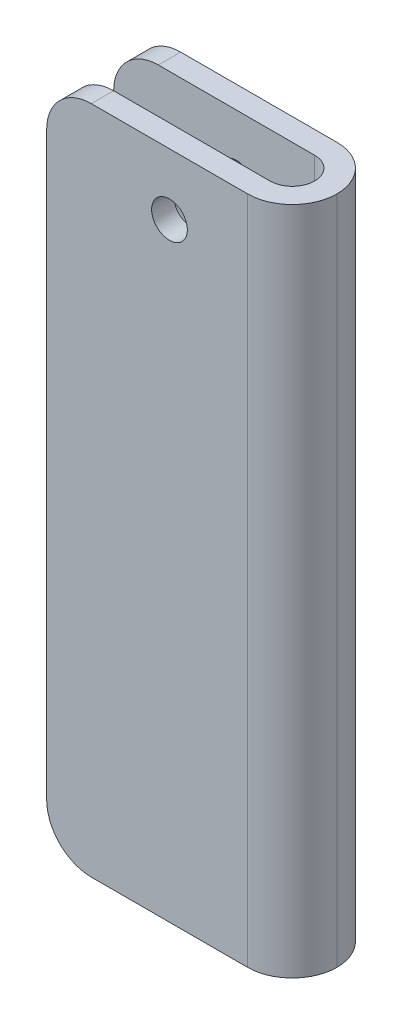
ISO-10303-21;
HEADER;
FILE_DESCRIPTION(('STEP AP214'),'2;1');
FILE_NAME('part.step','',(''),(''),'','','');
FILE_SCHEMA(('AUTOMOTIVE_DESIGN { 1 0 10303 214 1 1 1 1 }'));
ENDSEC;
DATA;
#1=APPLICATION_CONTEXT('core data for automotive mechanical design processes');
#2=APPLICATION_PROTOCOL_DEFINITION('international standard','automotive_design',2000,#1);
#3=PRODUCT_CONTEXT('',#1,'mechanical');
#4=PRODUCT('Part','Part','',(#3));
#5=PRODUCT_RELATED_PRODUCT_CATEGORY('part','',(#4));
#6=PRODUCT_DEFINITION_FORMATION('','',#4);
#7=PRODUCT_DEFINITION_CONTEXT('part definition',#1,'design');
#8=PRODUCT_DEFINITION('design','',#6,#7);
#9=PRODUCT_DEFINITION_SHAPE('','',#8);
#10=(LENGTH_UNIT() NAMED_UNIT(*) SI_UNIT(.MILLI.,.METRE.));
#11=(NAMED_UNIT(*) PLANE_ANGLE_UNIT() SI_UNIT($,.RADIAN.));
#12=(NAMED_UNIT(*) SI_UNIT($,.STERADIAN.) SOLID_ANGLE_UNIT());
#13=UNCERTAINTY_MEASURE_WITH_UNIT(LENGTH_MEASURE(1.E-05),#10,'distance_accuracy_value','');
#14=(GEOMETRIC_REPRESENTATION_CONTEXT(3) GLOBAL_UNCERTAINTY_ASSIGNED_CONTEXT((#13)) GLOBAL_UNIT_ASSIGNED_CONTEXT((#10,
#11,#12)) REPRESENTATION_CONTEXT('',''));
#15=CARTESIAN_POINT('',(0.,0.,0.));
#16=DIRECTION('',(0.,0.,1.));
#17=DIRECTION('',(1.,0.,0.));
#18=AXIS2_PLACEMENT_3D('',#15,#16,#17);
#19=CARTESIAN_POINT('',(-55.,0.,20.));
#20=DIRECTION('',(1.,0.,0.));
#21=DIRECTION('',(0.,0.,-1.));
#22=AXIS2_PLACEMENT_3D('',#19,#20,#21);
#23=PLANE('',#22);
#24=DIRECTION('',(0.,-1.,0.));
#25=VECTOR('',#24,1.);
#26=CARTESIAN_POINT('',(-55.,0.,0.));
#27=LINE('',#26,#25);
#28=CARTESIAN_POINT('',(-55.,140.,0.));
#29=VERTEX_POINT('',#28);
#30=CARTESIAN_POINT('',(-55.,10.,0.));
#31=VERTEX_POINT('',#30);
#32=EDGE_CURVE('E252',#29,#31,#27,.T.);
#33=ORIENTED_EDGE('',*,*,#32,.T.);
#34=DIRECTION('',(0.,0.,-1.));
#35=VECTOR('',#34,1.);
#36=CARTESIAN_POINT('',(-55.,10.,20.));
#37=LINE('',#36,#35);
#38=CARTESIAN_POINT('',(-55.,10.,5.));
#39=VERTEX_POINT('',#38);
#40=EDGE_CURVE('E206',#31,#39,#37,.F.);
#41=ORIENTED_EDGE('',*,*,#40,.T.);
#42=DIRECTION('',(0.,1.,0.));
#43=VECTOR('',#42,1.);
#44=CARTESIAN_POINT('',(-55.,0.,5.));
#45=LINE('',#44,#43);
#46=CARTESIAN_POINT('',(-55.,140.,5.));
#47=VERTEX_POINT('',#46);
#48=EDGE_CURVE('E238',#39,#47,#45,.T.);
#49=ORIENTED_EDGE('',*,*,#48,.T.);
#50=DIRECTION('',(0.,0.,-1.));
#51=VECTOR('',#50,1.);
#52=CARTESIAN_POINT('',(-55.,140.,20.));
#53=LINE('',#52,#51);
#54=EDGE_CURVE('E203',#47,#29,#53,.T.);
#55=ORIENTED_EDGE('',*,*,#54,.T.);
#56=EDGE_LOOP('',(#33,#41,#49,#55));
#57=FACE_BOUND('',#56,.T.);
#58=ADVANCED_FACE('F32',(#57),#23,.F.);
#59=CARTESIAN_POINT('',(0.,150.,20.));
#60=DIRECTION('',(0.,-1.,0.));
#61=DIRECTION('',(0.,0.,-1.));
#62=AXIS2_PLACEMENT_3D('',#59,#60,#61);
#63=PLANE('',#62);
#64=DIRECTION('',(-1.,0.,0.));
#65=VECTOR('',#64,1.);
#66=CARTESIAN_POINT('',(0.,150.,0.));
#67=LINE('',#66,#65);
#68=CARTESIAN_POINT('',(-10.,150.,0.));
#69=VERTEX_POINT('',#68);
#70=CARTESIAN_POINT('',(-45.,150.,0.));
#71=VERTEX_POINT('',#70);
#72=EDGE_CURVE('E242',#69,#71,#67,.T.);
#73=ORIENTED_EDGE('',*,*,#72,.T.);
#74=DIRECTION('',(0.,0.,-1.));
#75=VECTOR('',#74,1.);
#76=CARTESIAN_POINT('',(-45.,150.,20.));
#77=LINE('',#76,#75);
#78=CARTESIAN_POINT('',(-45.,150.,5.));
#79=VERTEX_POINT('',#78);
#80=EDGE_CURVE('E11',#71,#79,#77,.F.);
#81=ORIENTED_EDGE('',*,*,#80,.T.);
#82=DIRECTION('',(-1.,0.,0.));
#83=VECTOR('',#82,1.);
#84=CARTESIAN_POINT('',(-55.,150.,5.));
#85=LINE('',#84,#83);
#86=CARTESIAN_POINT('',(-10.,150.,5.));
#87=VERTEX_POINT('',#86);
#88=EDGE_CURVE('E142',#87,#79,#85,.T.);
#89=ORIENTED_EDGE('',*,*,#88,.F.);
#90=CARTESIAN_POINT('',(-10.,150.,10.));
#91=DIRECTION('',(0.,-1.,0.));
#92=DIRECTION('',(0.,0.,-1.));
#93=AXIS2_PLACEMENT_3D('',#90,#91,#92);
#94=CIRCLE('',#93,5.);
#95=CARTESIAN_POINT('',(-5.,150.,10.));
#96=VERTEX_POINT('',#95);
#97=EDGE_CURVE('E151',#87,#96,#94,.T.);
#98=ORIENTED_EDGE('',*,*,#97,.T.);
#99=CARTESIAN_POINT('',(-10.,150.,10.));
#100=DIRECTION('',(0.,-1.,0.));
#101=DIRECTION('',(0.,0.,-1.));
#102=AXIS2_PLACEMENT_3D('',#99,#100,#101);
#103=CIRCLE('',#102,5.);
#104=CARTESIAN_POINT('',(-10.,150.,15.));
#105=VERTEX_POINT('',#104);
#106=EDGE_CURVE('E146',#96,#105,#103,.T.);
#107=ORIENTED_EDGE('',*,*,#106,.T.);
#108=DIRECTION('',(1.,0.,0.));
#109=VECTOR('',#108,1.);
#110=CARTESIAN_POINT('',(-55.,150.,15.));
#111=LINE('',#110,#109);
#112=CARTESIAN_POINT('',(-45.,150.,15.));
#113=VERTEX_POINT('',#112);
#114=EDGE_CURVE('E134',#113,#105,#111,.T.);
#115=ORIENTED_EDGE('',*,*,#114,.F.);
#116=DIRECTION('',(0.,0.,-1.));
#117=VECTOR('',#116,1.);
#118=CARTESIAN_POINT('',(-45.,150.,20.));
#119=LINE('',#118,#117);
#120=CARTESIAN_POINT('',(-45.,150.,20.));
#121=VERTEX_POINT('',#120);
#122=EDGE_CURVE('E40',#113,#121,#119,.F.);
#123=ORIENTED_EDGE('',*,*,#122,.T.);
#124=DIRECTION('',(-1.,0.,0.));
#125=VECTOR('',#124,1.);
#126=CARTESIAN_POINT('',(0.,150.,20.));
#127=LINE('',#126,#125);
#128=CARTESIAN_POINT('',(-10.,150.,20.));
#129=VERTEX_POINT('',#128);
#130=EDGE_CURVE('E247',#129,#121,#127,.T.);
#131=ORIENTED_EDGE('',*,*,#130,.F.);
#132=CARTESIAN_POINT('',(-10.,150.,10.));
#133=DIRECTION('',(0.,-1.,0.));
#134=DIRECTION('',(0.,0.,-1.));
#135=AXIS2_PLACEMENT_3D('',#132,#133,#134);
#136=CIRCLE('',#135,10.);
#137=CARTESIAN_POINT('',(0.,150.,10.));
#138=VERTEX_POINT('',#137);
#139=EDGE_CURVE('E173',#129,#138,#136,.F.);
#140=ORIENTED_EDGE('',*,*,#139,.T.);
#141=CARTESIAN_POINT('',(-10.,150.,10.));
#142=DIRECTION('',(0.,-1.,0.));
#143=DIRECTION('',(0.,0.,-1.));
#144=AXIS2_PLACEMENT_3D('',#141,#142,#143);
#145=CIRCLE('',#144,10.);
#146=EDGE_CURVE('E179',#138,#69,#145,.F.);
#147=ORIENTED_EDGE('',*,*,#146,.T.);
#148=EDGE_LOOP('',(#73,#81,#89,#98,#107,#115,#123,#131,#140,#147));
#149=FACE_BOUND('',#148,.T.);
#150=ADVANCED_FACE('F148',(#149),#63,.F.);
#151=DIRECTION('',(0.,1.,0.));
#152=VECTOR('',#151,1.);
#153=CARTESIAN_POINT('',(-55.,0.,15.));
#154=LINE('',#153,#152);
#155=CARTESIAN_POINT('',(-55.,10.,15.));
#156=VERTEX_POINT('',#155);
#157=CARTESIAN_POINT('',(-55.,140.,15.));
#158=VERTEX_POINT('',#157);
#159=EDGE_CURVE('E234',#156,#158,#154,.T.);
#160=ORIENTED_EDGE('',*,*,#159,.F.);
#161=DIRECTION('',(0.,0.,-1.));
#162=VECTOR('',#161,1.);
#163=CARTESIAN_POINT('',(-55.,10.,20.));
#164=LINE('',#163,#162);
#165=CARTESIAN_POINT('',(-55.,10.,20.));
#166=VERTEX_POINT('',#165);
#167=EDGE_CURVE('E54',#156,#166,#164,.F.);
#168=ORIENTED_EDGE('',*,*,#167,.T.);
#169=DIRECTION('',(0.,-1.,0.));
#170=VECTOR('',#169,1.);
#171=CARTESIAN_POINT('',(-55.,0.,20.));
#172=LINE('',#171,#170);
#173=CARTESIAN_POINT('',(-55.,140.,20.));
#174=VERTEX_POINT('',#173);
#175=EDGE_CURVE('E163',#174,#166,#172,.T.);
#176=ORIENTED_EDGE('',*,*,#175,.F.);
#177=DIRECTION('',(0.,0.,-1.));
#178=VECTOR('',#177,1.);
#179=CARTESIAN_POINT('',(-55.,140.,20.));
#180=LINE('',#179,#178);
#181=EDGE_CURVE('E215',#174,#158,#180,.T.);
#182=ORIENTED_EDGE('',*,*,#181,.T.);
#183=EDGE_LOOP('',(#160,#168,#176,#182));
#184=FACE_BOUND('',#183,.T.);
#185=ADVANCED_FACE('F236',(#184),#23,.F.);
#186=CARTESIAN_POINT('',(0.,0.,20.));
#187=DIRECTION('',(0.,1.,0.));
#188=DIRECTION('',(0.,0.,1.));
#189=AXIS2_PLACEMENT_3D('',#186,#187,#188);
#190=PLANE('',#189);
#191=DIRECTION('',(-1.,0.,0.));
#192=VECTOR('',#191,1.);
#193=CARTESIAN_POINT('',(-55.,0.,5.));
#194=LINE('',#193,#192);
#195=CARTESIAN_POINT('',(-10.,0.,5.));
#196=VERTEX_POINT('',#195);
#197=CARTESIAN_POINT('',(-45.,0.,5.));
#198=VERTEX_POINT('',#197);
#199=EDGE_CURVE('E239',#196,#198,#194,.T.);
#200=ORIENTED_EDGE('',*,*,#199,.T.);
#201=DIRECTION('',(0.,0.,-1.));
#202=VECTOR('',#201,1.);
#203=CARTESIAN_POINT('',(-45.,0.,20.));
#204=LINE('',#203,#202);
#205=CARTESIAN_POINT('',(-45.,0.,0.));
#206=VERTEX_POINT('',#205);
#207=EDGE_CURVE('E196',#198,#206,#204,.T.);
#208=ORIENTED_EDGE('',*,*,#207,.T.);
#209=DIRECTION('',(1.,0.,0.));
#210=VECTOR('',#209,1.);
#211=CARTESIAN_POINT('',(0.,0.,0.));
#212=LINE('',#211,#210);
#213=CARTESIAN_POINT('',(-10.,0.,0.));
#214=VERTEX_POINT('',#213);
#215=EDGE_CURVE('E249',#206,#214,#212,.T.);
#216=ORIENTED_EDGE('',*,*,#215,.T.);
#217=CARTESIAN_POINT('',(-10.,0.,10.));
#218=DIRECTION('',(0.,1.,0.));
#219=DIRECTION('',(0.,0.,1.));
#220=AXIS2_PLACEMENT_3D('',#217,#218,#219);
#221=CIRCLE('',#220,10.);
#222=CARTESIAN_POINT('',(0.,0.,10.));
#223=VERTEX_POINT('',#222);
#224=EDGE_CURVE('E187',#214,#223,#221,.F.);
#225=ORIENTED_EDGE('',*,*,#224,.T.);
#226=CARTESIAN_POINT('',(-10.,0.,10.));
#227=DIRECTION('',(0.,1.,0.));
#228=DIRECTION('',(0.,0.,1.));
#229=AXIS2_PLACEMENT_3D('',#226,#227,#228);
#230=CIRCLE('',#229,10.);
#231=CARTESIAN_POINT('',(-10.,0.,20.));
#232=VERTEX_POINT('',#231);
#233=EDGE_CURVE('E184',#223,#232,#230,.F.);
#234=ORIENTED_EDGE('',*,*,#233,.T.);
#235=DIRECTION('',(1.,0.,0.));
#236=VECTOR('',#235,1.);
#237=CARTESIAN_POINT('',(0.,0.,20.));
#238=LINE('',#237,#236);
#239=CARTESIAN_POINT('',(-45.,0.,20.));
#240=VERTEX_POINT('',#239);
#241=EDGE_CURVE('E160',#240,#232,#238,.T.);
#242=ORIENTED_EDGE('',*,*,#241,.F.);
#243=DIRECTION('',(0.,0.,-1.));
#244=VECTOR('',#243,1.);
#245=CARTESIAN_POINT('',(-45.,0.,20.));
#246=LINE('',#245,#244);
#247=CARTESIAN_POINT('',(-45.,0.,15.));
#248=VERTEX_POINT('',#247);
#249=EDGE_CURVE('E191',#240,#248,#246,.T.);
#250=ORIENTED_EDGE('',*,*,#249,.T.);
#251=DIRECTION('',(1.,0.,0.));
#252=VECTOR('',#251,1.);
#253=CARTESIAN_POINT('',(-55.,0.,15.));
#254=LINE('',#253,#252);
#255=CARTESIAN_POINT('',(-10.,0.,15.));
#256=VERTEX_POINT('',#255);
#257=EDGE_CURVE('E235',#248,#256,#254,.T.);
#258=ORIENTED_EDGE('',*,*,#257,.T.);
#259=CARTESIAN_POINT('',(-10.,0.,10.));
#260=DIRECTION('',(0.,1.,0.));
#261=DIRECTION('',(0.,0.,1.));
#262=AXIS2_PLACEMENT_3D('',#259,#260,#261);
#263=CIRCLE('',#262,5.);
#264=CARTESIAN_POINT('',(-5.,0.,10.));
#265=VERTEX_POINT('',#264);
#266=EDGE_CURVE('E155',#256,#265,#263,.T.);
#267=ORIENTED_EDGE('',*,*,#266,.T.);
#268=CARTESIAN_POINT('',(-10.,0.,10.));
#269=DIRECTION('',(0.,1.,0.));
#270=DIRECTION('',(0.,0.,1.));
#271=AXIS2_PLACEMENT_3D('',#268,#269,#270);
#272=CIRCLE('',#271,5.);
#273=EDGE_CURVE('E171',#265,#196,#272,.T.);
#274=ORIENTED_EDGE('',*,*,#273,.T.);
#275=EDGE_LOOP('',(#200,#208,#216,#225,#234,#242,#250,#258,#267,#274));
#276=FACE_BOUND('',#275,.T.);
#277=ADVANCED_FACE('F230',(#276),#190,.F.);
#278=CARTESIAN_POINT('',(0.,0.,20.));
#279=DIRECTION('',(0.,0.,1.));
#280=DIRECTION('',(1.,0.,0.));
#281=AXIS2_PLACEMENT_3D('',#278,#279,#280);
#282=PLANE('',#281);
#283=CARTESIAN_POINT('',(-27.5,136.252865990355,20.));
#284=DIRECTION('',(0.,0.,-1.));
#285=DIRECTION('',(-1.,0.,0.));
#286=AXIS2_PLACEMENT_3D('',#283,#284,#285);
#287=CIRCLE('',#286,4.);
#288=CARTESIAN_POINT('',(-31.5,136.252865990355,20.));
#289=VERTEX_POINT('',#288);
#290=EDGE_CURVE('E291',#289,#289,#287,.T.);
#291=ORIENTED_EDGE('',*,*,#290,.T.);
#292=EDGE_LOOP('',(#291));
#293=FACE_BOUND('',#292,.T.);
#294=ORIENTED_EDGE('',*,*,#175,.T.);
#295=CARTESIAN_POINT('',(-45.,10.,20.));
#296=DIRECTION('',(0.,0.,1.));
#297=DIRECTION('',(1.,0.,0.));
#298=AXIS2_PLACEMENT_3D('',#295,#296,#297);
#299=CIRCLE('',#298,10.);
#300=EDGE_CURVE('E221',#166,#240,#299,.T.);
#301=ORIENTED_EDGE('',*,*,#300,.T.);
#302=ORIENTED_EDGE('',*,*,#241,.T.);
#303=DIRECTION('',(0.,1.,0.));
#304=VECTOR('',#303,1.);
#305=CARTESIAN_POINT('',(-10.,150.,20.));
#306=LINE('',#305,#304);
#307=EDGE_CURVE('E189',#232,#129,#306,.T.);
#308=ORIENTED_EDGE('',*,*,#307,.T.);
#309=ORIENTED_EDGE('',*,*,#130,.T.);
#310=CARTESIAN_POINT('',(-45.,140.,20.));
#311=DIRECTION('',(0.,0.,1.));
#312=DIRECTION('',(1.,0.,0.));
#313=AXIS2_PLACEMENT_3D('',#310,#311,#312);
#314=CIRCLE('',#313,10.);
#315=EDGE_CURVE('E219',#121,#174,#314,.T.);
#316=ORIENTED_EDGE('',*,*,#315,.T.);
#317=EDGE_LOOP('',(#294,#301,#302,#308,#309,#316));
#318=FACE_BOUND('',#317,.T.);
#319=ADVANCED_FACE('F225',(#293,#318),#282,.T.);
#320=CARTESIAN_POINT('',(0.,0.,0.));
#321=DIRECTION('',(0.,0.,1.));
#322=DIRECTION('',(1.,0.,0.));
#323=AXIS2_PLACEMENT_3D('',#320,#321,#322);
#324=PLANE('',#323);
#325=CARTESIAN_POINT('',(-27.5,136.252865990355,0.));
#326=DIRECTION('',(0.,0.,-1.));
#327=DIRECTION('',(-1.,0.,0.));
#328=AXIS2_PLACEMENT_3D('',#325,#326,#327);
#329=CIRCLE('',#328,4.);
#330=CARTESIAN_POINT('',(-31.5,136.252865990355,0.));
#331=VERTEX_POINT('',#330);
#332=EDGE_CURVE('E176',#331,#331,#329,.T.);
#333=ORIENTED_EDGE('',*,*,#332,.F.);
#334=EDGE_LOOP('',(#333));
#335=FACE_BOUND('',#334,.T.);
#336=ORIENTED_EDGE('',*,*,#215,.F.);
#337=CARTESIAN_POINT('',(-45.,10.,0.));
#338=DIRECTION('',(0.,0.,1.));
#339=DIRECTION('',(1.,0.,0.));
#340=AXIS2_PLACEMENT_3D('',#337,#338,#339);
#341=CIRCLE('',#340,10.);
#342=EDGE_CURVE('E201',#206,#31,#341,.F.);
#343=ORIENTED_EDGE('',*,*,#342,.T.);
#344=ORIENTED_EDGE('',*,*,#32,.F.);
#345=CARTESIAN_POINT('',(-45.,140.,0.));
#346=DIRECTION('',(0.,0.,1.));
#347=DIRECTION('',(1.,0.,0.));
#348=AXIS2_PLACEMENT_3D('',#345,#346,#347);
#349=CIRCLE('',#348,10.);
#350=EDGE_CURVE('E199',#29,#71,#349,.F.);
#351=ORIENTED_EDGE('',*,*,#350,.T.);
#352=ORIENTED_EDGE('',*,*,#72,.F.);
#353=DIRECTION('',(0.,1.,0.));
#354=VECTOR('',#353,1.);
#355=CARTESIAN_POINT('',(-10.,0.,0.));
#356=LINE('',#355,#354);
#357=EDGE_CURVE('E181',#69,#214,#356,.F.);
#358=ORIENTED_EDGE('',*,*,#357,.T.);
#359=EDGE_LOOP('',(#336,#343,#344,#351,#352,#358));
#360=FACE_BOUND('',#359,.T.);
#361=ADVANCED_FACE('F264',(#335,#360),#324,.F.);
#362=CARTESIAN_POINT('',(-55.,0.,5.));
#363=DIRECTION('',(0.,0.,-1.));
#364=DIRECTION('',(-1.,0.,0.));
#365=AXIS2_PLACEMENT_3D('',#362,#363,#364);
#366=PLANE('',#365);
#367=CARTESIAN_POINT('',(-27.5,136.252865990355,5.));
#368=DIRECTION('',(0.,0.,-1.));
#369=DIRECTION('',(-1.,0.,0.));
#370=AXIS2_PLACEMENT_3D('',#367,#368,#369);
#371=CIRCLE('',#370,4.);
#372=CARTESIAN_POINT('',(-31.5,136.252865990355,5.));
#373=VERTEX_POINT('',#372);
#374=EDGE_CURVE('E143',#373,#373,#371,.T.);
#375=ORIENTED_EDGE('',*,*,#374,.T.);
#376=EDGE_LOOP('',(#375));
#377=FACE_BOUND('',#376,.T.);
#378=ORIENTED_EDGE('',*,*,#48,.F.);
#379=CARTESIAN_POINT('',(-45.,10.,5.));
#380=DIRECTION('',(0.,0.,-1.));
#381=DIRECTION('',(-1.,0.,0.));
#382=AXIS2_PLACEMENT_3D('',#379,#380,#381);
#383=CIRCLE('',#382,10.);
#384=EDGE_CURVE('E210',#39,#198,#383,.F.);
#385=ORIENTED_EDGE('',*,*,#384,.T.);
#386=ORIENTED_EDGE('',*,*,#199,.F.);
#387=DIRECTION('',(0.,1.,0.));
#388=VECTOR('',#387,1.);
#389=CARTESIAN_POINT('',(-10.,150.,5.));
#390=LINE('',#389,#388);
#391=EDGE_CURVE('E156',#196,#87,#390,.T.);
#392=ORIENTED_EDGE('',*,*,#391,.T.);
#393=ORIENTED_EDGE('',*,*,#88,.T.);
#394=CARTESIAN_POINT('',(-45.,140.,5.));
#395=DIRECTION('',(0.,0.,-1.));
#396=DIRECTION('',(-1.,0.,0.));
#397=AXIS2_PLACEMENT_3D('',#394,#395,#396);
#398=CIRCLE('',#397,10.);
#399=EDGE_CURVE('E208',#79,#47,#398,.F.);
#400=ORIENTED_EDGE('',*,*,#399,.T.);
#401=EDGE_LOOP('',(#378,#385,#386,#392,#393,#400));
#402=FACE_BOUND('',#401,.T.);
#403=ADVANCED_FACE('F274',(#377,#402),#366,.F.);
#404=CARTESIAN_POINT('',(-55.,0.,15.));
#405=DIRECTION('',(0.,0.,1.));
#406=DIRECTION('',(1.,0.,0.));
#407=AXIS2_PLACEMENT_3D('',#404,#405,#406);
#408=PLANE('',#407);
#409=CARTESIAN_POINT('',(-27.5,136.252865990355,15.));
#410=DIRECTION('',(0.,0.,1.));
#411=DIRECTION('',(1.,0.,0.));
#412=AXIS2_PLACEMENT_3D('',#409,#410,#411);
#413=CIRCLE('',#412,4.);
#414=CARTESIAN_POINT('',(-23.5,136.252865990355,15.));
#415=VERTEX_POINT('',#414);
#416=EDGE_CURVE('E166',#415,#415,#413,.T.);
#417=ORIENTED_EDGE('',*,*,#416,.T.);
#418=EDGE_LOOP('',(#417));
#419=FACE_BOUND('',#418,.T.);
#420=ORIENTED_EDGE('',*,*,#257,.F.);
#421=CARTESIAN_POINT('',(-45.,10.,15.));
#422=DIRECTION('',(0.,0.,1.));
#423=DIRECTION('',(1.,0.,0.));
#424=AXIS2_PLACEMENT_3D('',#421,#422,#423);
#425=CIRCLE('',#424,10.);
#426=EDGE_CURVE('E213',#248,#156,#425,.F.);
#427=ORIENTED_EDGE('',*,*,#426,.T.);
#428=ORIENTED_EDGE('',*,*,#159,.T.);
#429=CARTESIAN_POINT('',(-45.,140.,15.));
#430=DIRECTION('',(0.,0.,1.));
#431=DIRECTION('',(1.,0.,0.));
#432=AXIS2_PLACEMENT_3D('',#429,#430,#431);
#433=CIRCLE('',#432,10.);
#434=EDGE_CURVE('E141',#158,#113,#433,.F.);
#435=ORIENTED_EDGE('',*,*,#434,.T.);
#436=ORIENTED_EDGE('',*,*,#114,.T.);
#437=DIRECTION('',(0.,1.,0.));
#438=VECTOR('',#437,1.);
#439=CARTESIAN_POINT('',(-10.,0.,15.));
#440=LINE('',#439,#438);
#441=EDGE_CURVE('E139',#105,#256,#440,.F.);
#442=ORIENTED_EDGE('',*,*,#441,.T.);
#443=EDGE_LOOP('',(#420,#427,#428,#435,#436,#442));
#444=FACE_BOUND('',#443,.T.);
#445=ADVANCED_FACE('F137',(#419,#444),#408,.F.);
#446=CARTESIAN_POINT('',(-27.5,136.252865990355,20.));
#447=DIRECTION('',(0.,0.,-1.));
#448=DIRECTION('',(-1.,0.,0.));
#449=AXIS2_PLACEMENT_3D('',#446,#447,#448);
#450=CYLINDRICAL_SURFACE('',#449,4.);
#451=ORIENTED_EDGE('',*,*,#290,.F.);
#452=EDGE_LOOP('',(#451));
#453=FACE_BOUND('',#452,.T.);
#454=ORIENTED_EDGE('',*,*,#416,.F.);
#455=EDGE_LOOP('',(#454));
#456=FACE_BOUND('',#455,.T.);
#457=ADVANCED_FACE('F299',(#453,#456),#450,.F.);
#458=ORIENTED_EDGE('',*,*,#332,.T.);
#459=EDGE_LOOP('',(#458));
#460=FACE_BOUND('',#459,.T.);
#461=ORIENTED_EDGE('',*,*,#374,.F.);
#462=EDGE_LOOP('',(#461));
#463=FACE_BOUND('',#462,.T.);
#464=ADVANCED_FACE('F301',(#460,#463),#450,.F.);
#465=CARTESIAN_POINT('',(-10.,0.,10.));
#466=DIRECTION('',(0.,-1.,0.));
#467=DIRECTION('',(0.,0.,-1.));
#468=AXIS2_PLACEMENT_3D('',#465,#466,#467);
#469=CYLINDRICAL_SURFACE('',#468,5.);
#470=ORIENTED_EDGE('',*,*,#391,.F.);
#471=ORIENTED_EDGE('',*,*,#273,.F.);
#472=DIRECTION('',(0.,1.,0.));
#473=VECTOR('',#472,1.);
#474=CARTESIAN_POINT('',(-5.,0.,10.));
#475=LINE('',#474,#473);
#476=EDGE_CURVE('E174',#96,#265,#475,.F.);
#477=ORIENTED_EDGE('',*,*,#476,.F.);
#478=ORIENTED_EDGE('',*,*,#97,.F.);
#479=EDGE_LOOP('',(#470,#471,#477,#478));
#480=FACE_BOUND('',#479,.T.);
#481=ADVANCED_FACE('F284',(#480),#469,.F.);
#482=CARTESIAN_POINT('',(-10.,0.,10.));
#483=DIRECTION('',(0.,-1.,0.));
#484=DIRECTION('',(0.,0.,-1.));
#485=AXIS2_PLACEMENT_3D('',#482,#483,#484);
#486=CYLINDRICAL_SURFACE('',#485,5.);
#487=ORIENTED_EDGE('',*,*,#266,.F.);
#488=ORIENTED_EDGE('',*,*,#441,.F.);
#489=ORIENTED_EDGE('',*,*,#106,.F.);
#490=ORIENTED_EDGE('',*,*,#476,.T.);
#491=EDGE_LOOP('',(#487,#488,#489,#490));
#492=FACE_BOUND('',#491,.T.);
#493=ADVANCED_FACE('F159',(#492),#486,.F.);
#494=CARTESIAN_POINT('',(-10.,0.,10.));
#495=DIRECTION('',(0.,-1.,0.));
#496=DIRECTION('',(0.,0.,-1.));
#497=AXIS2_PLACEMENT_3D('',#494,#495,#496);
#498=CYLINDRICAL_SURFACE('',#497,10.);
#499=ORIENTED_EDGE('',*,*,#307,.F.);
#500=ORIENTED_EDGE('',*,*,#233,.F.);
#501=DIRECTION('',(0.,1.,0.));
#502=VECTOR('',#501,1.);
#503=CARTESIAN_POINT('',(0.,0.,10.));
#504=LINE('',#503,#502);
#505=EDGE_CURVE('E177',#138,#223,#504,.F.);
#506=ORIENTED_EDGE('',*,*,#505,.F.);
#507=ORIENTED_EDGE('',*,*,#139,.F.);
#508=EDGE_LOOP('',(#499,#500,#506,#507));
#509=FACE_BOUND('',#508,.T.);
#510=ADVANCED_FACE('F382',(#509),#498,.T.);
#511=CARTESIAN_POINT('',(-10.,0.,10.));
#512=DIRECTION('',(0.,1.,0.));
#513=DIRECTION('',(0.,0.,1.));
#514=AXIS2_PLACEMENT_3D('',#511,#512,#513);
#515=CYLINDRICAL_SURFACE('',#514,10.);
#516=ORIENTED_EDGE('',*,*,#224,.F.);
#517=ORIENTED_EDGE('',*,*,#357,.F.);
#518=ORIENTED_EDGE('',*,*,#146,.F.);
#519=ORIENTED_EDGE('',*,*,#505,.T.);
#520=EDGE_LOOP('',(#516,#517,#518,#519));
#521=FACE_BOUND('',#520,.T.);
#522=ADVANCED_FACE('F260',(#521),#515,.T.);
#523=CARTESIAN_POINT('',(-45.,10.,20.));
#524=DIRECTION('',(0.,0.,-1.));
#525=DIRECTION('',(-1.,0.,0.));
#526=AXIS2_PLACEMENT_3D('',#523,#524,#525);
#527=CYLINDRICAL_SURFACE('',#526,10.);
#528=ORIENTED_EDGE('',*,*,#384,.F.);
#529=ORIENTED_EDGE('',*,*,#40,.F.);
#530=ORIENTED_EDGE('',*,*,#342,.F.);
#531=ORIENTED_EDGE('',*,*,#207,.F.);
#532=EDGE_LOOP('',(#528,#529,#530,#531));
#533=FACE_BOUND('',#532,.T.);
#534=ADVANCED_FACE('F279',(#533),#527,.T.);
#535=CARTESIAN_POINT('',(-45.,10.,20.));
#536=DIRECTION('',(0.,0.,-1.));
#537=DIRECTION('',(-1.,0.,0.));
#538=AXIS2_PLACEMENT_3D('',#535,#536,#537);
#539=CYLINDRICAL_SURFACE('',#538,10.);
#540=ORIENTED_EDGE('',*,*,#300,.F.);
#541=ORIENTED_EDGE('',*,*,#167,.F.);
#542=ORIENTED_EDGE('',*,*,#426,.F.);
#543=ORIENTED_EDGE('',*,*,#249,.F.);
#544=EDGE_LOOP('',(#540,#541,#542,#543));
#545=FACE_BOUND('',#544,.T.);
#546=ADVANCED_FACE('F233',(#545),#539,.T.);
#547=CARTESIAN_POINT('',(-45.,140.,20.));
#548=DIRECTION('',(0.,0.,-1.));
#549=DIRECTION('',(-1.,0.,0.));
#550=AXIS2_PLACEMENT_3D('',#547,#548,#549);
#551=CYLINDRICAL_SURFACE('',#550,10.);
#552=ORIENTED_EDGE('',*,*,#399,.F.);
#553=ORIENTED_EDGE('',*,*,#80,.F.);
#554=ORIENTED_EDGE('',*,*,#350,.F.);
#555=ORIENTED_EDGE('',*,*,#54,.F.);
#556=EDGE_LOOP('',(#552,#553,#554,#555));
#557=FACE_BOUND('',#556,.T.);
#558=ADVANCED_FACE('F270',(#557),#551,.T.);
#559=CARTESIAN_POINT('',(-45.,140.,20.));
#560=DIRECTION('',(0.,0.,-1.));
#561=DIRECTION('',(-1.,0.,0.));
#562=AXIS2_PLACEMENT_3D('',#559,#560,#561);
#563=CYLINDRICAL_SURFACE('',#562,10.);
#564=ORIENTED_EDGE('',*,*,#315,.F.);
#565=ORIENTED_EDGE('',*,*,#122,.F.);
#566=ORIENTED_EDGE('',*,*,#434,.F.);
#567=ORIENTED_EDGE('',*,*,#181,.F.);
#568=EDGE_LOOP('',(#564,#565,#566,#567));
#569=FACE_BOUND('',#568,.T.);
#570=ADVANCED_FACE('F34',(#569),#563,.T.);
#571=CLOSED_SHELL('',(#58,#150,#185,#277,#319,#361,#403,#445,#457,#464,#481,#493,#510,#522,#534,
#546,#558,#570));
#572=MANIFOLD_SOLID_BREP('B2',#571);
#573=ADVANCED_BREP_SHAPE_REPRESENTATION('',(#18,#572),#14);
#574=SHAPE_DEFINITION_REPRESENTATION(#9,#573);
ENDSEC;
END-ISO-10303-21;
